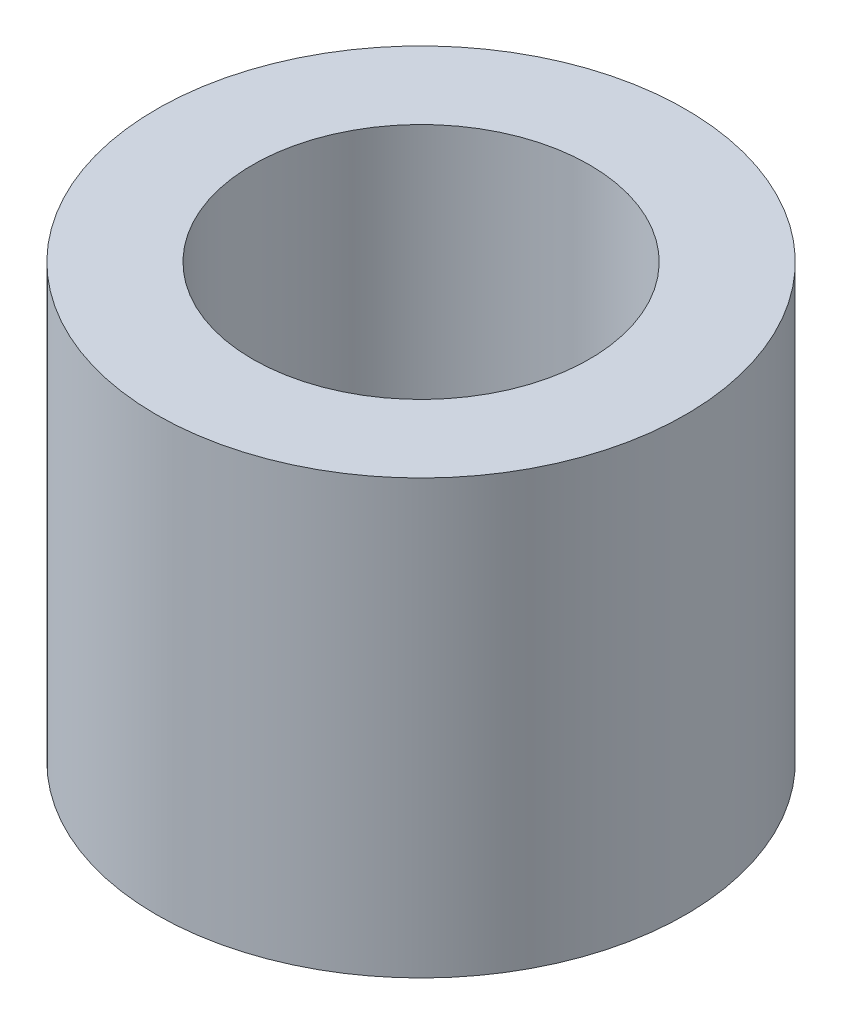
ISO-10303-21;
HEADER;
FILE_DESCRIPTION(('STEP AP214'),'2;1');
FILE_NAME('part.step','',(''),(''),'','','');
FILE_SCHEMA(('AUTOMOTIVE_DESIGN { 1 0 10303 214 1 1 1 1 }'));
ENDSEC;
DATA;
#1=APPLICATION_CONTEXT('core data for automotive mechanical design processes');
#2=APPLICATION_PROTOCOL_DEFINITION('international standard','automotive_design',2000,#1);
#3=PRODUCT_CONTEXT('',#1,'mechanical');
#4=PRODUCT('Part','Part','',(#3));
#5=PRODUCT_RELATED_PRODUCT_CATEGORY('part','',(#4));
#6=PRODUCT_DEFINITION_FORMATION('','',#4);
#7=PRODUCT_DEFINITION_CONTEXT('part definition',#1,'design');
#8=PRODUCT_DEFINITION('design','',#6,#7);
#9=PRODUCT_DEFINITION_SHAPE('','',#8);
#10=(LENGTH_UNIT() NAMED_UNIT(*) SI_UNIT(.MILLI.,.METRE.));
#11=(NAMED_UNIT(*) PLANE_ANGLE_UNIT() SI_UNIT($,.RADIAN.));
#12=(NAMED_UNIT(*) SI_UNIT($,.STERADIAN.) SOLID_ANGLE_UNIT());
#13=UNCERTAINTY_MEASURE_WITH_UNIT(LENGTH_MEASURE(1.E-05),#10,'distance_accuracy_value','');
#14=(GEOMETRIC_REPRESENTATION_CONTEXT(3) GLOBAL_UNCERTAINTY_ASSIGNED_CONTEXT((#13)) GLOBAL_UNIT_ASSIGNED_CONTEXT((#10,
#11,#12)) REPRESENTATION_CONTEXT('',''));
#15=CARTESIAN_POINT('',(0.,0.,0.));
#16=DIRECTION('',(0.,0.,1.));
#17=DIRECTION('',(1.,0.,0.));
#18=AXIS2_PLACEMENT_3D('',#15,#16,#17);
#19=CARTESIAN_POINT('',(0.,4.5,0.));
#20=DIRECTION('',(0.,1.,0.));
#21=DIRECTION('',(0.,0.,1.));
#22=AXIS2_PLACEMENT_3D('',#19,#20,#21);
#23=PLANE('',#22);
#24=CARTESIAN_POINT('',(0.,4.5,0.));
#25=DIRECTION('',(0.,1.,0.));
#26=DIRECTION('',(0.,0.,1.));
#27=AXIS2_PLACEMENT_3D('',#24,#25,#26);
#28=CIRCLE('',#27,2.75);
#29=CARTESIAN_POINT('',(0.,4.5,2.75));
#30=VERTEX_POINT('',#29);
#31=EDGE_CURVE('E10',#30,#30,#28,.T.);
#32=ORIENTED_EDGE('',*,*,#31,.T.);
#33=EDGE_LOOP('',(#32));
#34=FACE_BOUND('',#33,.T.);
#35=CARTESIAN_POINT('',(0.,4.5,0.));
#36=DIRECTION('',(0.,1.,0.));
#37=DIRECTION('',(0.,0.,1.));
#38=AXIS2_PLACEMENT_3D('',#35,#36,#37);
#39=CIRCLE('',#38,1.75);
#40=CARTESIAN_POINT('',(0.,4.5,1.75));
#41=VERTEX_POINT('',#40);
#42=EDGE_CURVE('E56',#41,#41,#39,.T.);
#43=ORIENTED_EDGE('',*,*,#42,.F.);
#44=EDGE_LOOP('',(#43));
#45=FACE_BOUND('',#44,.T.);
#46=ADVANCED_FACE('F43',(#34,#45),#23,.T.);
#47=CARTESIAN_POINT('',(0.,0.,0.));
#48=DIRECTION('',(0.,1.,0.));
#49=DIRECTION('',(0.,0.,1.));
#50=AXIS2_PLACEMENT_3D('',#47,#48,#49);
#51=PLANE('',#50);
#52=CARTESIAN_POINT('',(0.,0.,0.));
#53=DIRECTION('',(0.,1.,0.));
#54=DIRECTION('',(0.,0.,1.));
#55=AXIS2_PLACEMENT_3D('',#52,#53,#54);
#56=CIRCLE('',#55,2.75);
#57=CARTESIAN_POINT('',(0.,0.,2.75));
#58=VERTEX_POINT('',#57);
#59=EDGE_CURVE('E47',#58,#58,#56,.T.);
#60=ORIENTED_EDGE('',*,*,#59,.F.);
#61=EDGE_LOOP('',(#60));
#62=FACE_BOUND('',#61,.T.);
#63=CARTESIAN_POINT('',(0.,0.,0.));
#64=DIRECTION('',(0.,1.,0.));
#65=DIRECTION('',(0.,0.,1.));
#66=AXIS2_PLACEMENT_3D('',#63,#64,#65);
#67=CIRCLE('',#66,1.75);
#68=CARTESIAN_POINT('',(0.,0.,1.75));
#69=VERTEX_POINT('',#68);
#70=EDGE_CURVE('E58',#69,#69,#67,.T.);
#71=ORIENTED_EDGE('',*,*,#70,.T.);
#72=EDGE_LOOP('',(#71));
#73=FACE_BOUND('',#72,.T.);
#74=ADVANCED_FACE('F70',(#62,#73),#51,.F.);
#75=CARTESIAN_POINT('',(0.,4.5,0.));
#76=DIRECTION('',(0.,-1.,0.));
#77=DIRECTION('',(0.,0.,-1.));
#78=AXIS2_PLACEMENT_3D('',#75,#76,#77);
#79=CYLINDRICAL_SURFACE('',#78,2.75);
#80=ORIENTED_EDGE('',*,*,#31,.F.);
#81=EDGE_LOOP('',(#80));
#82=FACE_BOUND('',#81,.T.);
#83=ORIENTED_EDGE('',*,*,#59,.T.);
#84=EDGE_LOOP('',(#83));
#85=FACE_BOUND('',#84,.T.);
#86=ADVANCED_FACE('F45',(#82,#85),#79,.T.);
#87=CARTESIAN_POINT('',(0.,4.5,0.));
#88=DIRECTION('',(0.,-1.,0.));
#89=DIRECTION('',(0.,0.,-1.));
#90=AXIS2_PLACEMENT_3D('',#87,#88,#89);
#91=CYLINDRICAL_SURFACE('',#90,1.75);
#92=ORIENTED_EDGE('',*,*,#42,.T.);
#93=EDGE_LOOP('',(#92));
#94=FACE_BOUND('',#93,.T.);
#95=ORIENTED_EDGE('',*,*,#70,.F.);
#96=EDGE_LOOP('',(#95));
#97=FACE_BOUND('',#96,.T.);
#98=ADVANCED_FACE('F66',(#94,#97),#91,.F.);
#99=CLOSED_SHELL('',(#46,#74,#86,#98));
#100=MANIFOLD_SOLID_BREP('B2',#99);
#101=ADVANCED_BREP_SHAPE_REPRESENTATION('',(#18,#100),#14);
#102=SHAPE_DEFINITION_REPRESENTATION(#9,#101);
ENDSEC;
END-ISO-10303-21;
